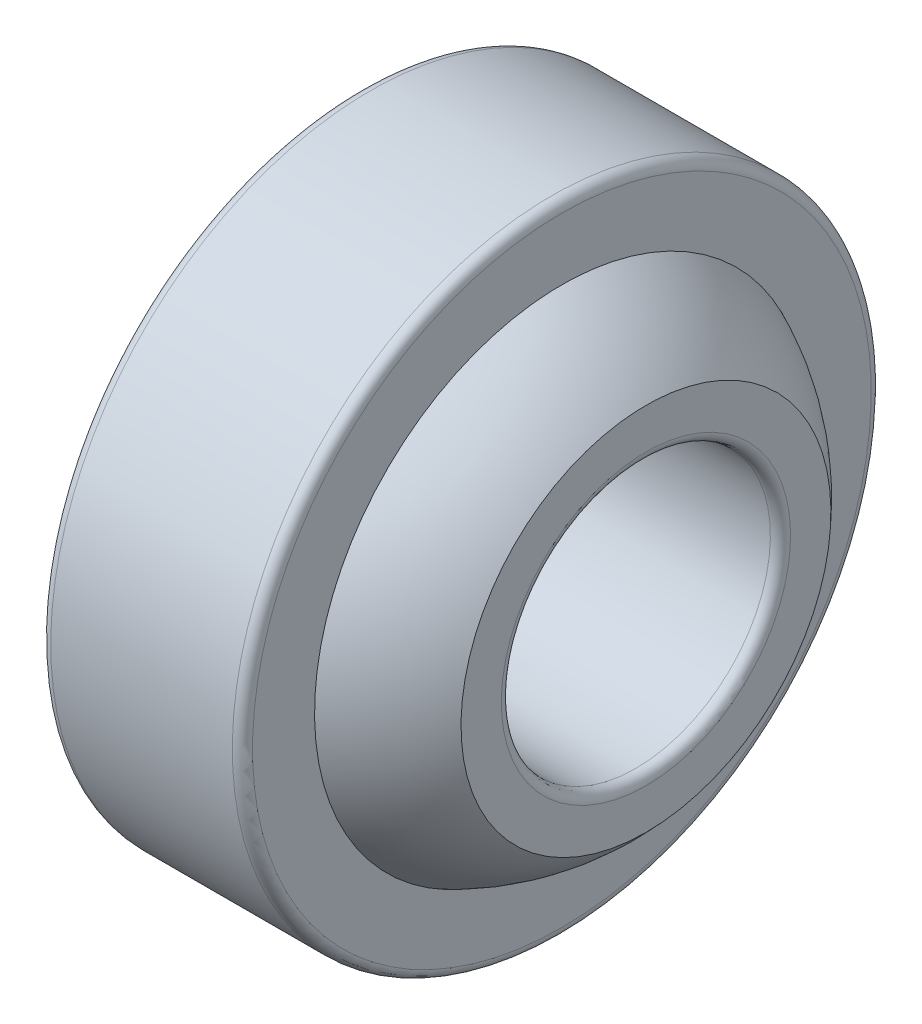
ISO-10303-21;
HEADER;
FILE_DESCRIPTION(('STEP AP214'),'2;1');
FILE_NAME('part.step','',(''),(''),'','','');
FILE_SCHEMA(('AUTOMOTIVE_DESIGN { 1 0 10303 214 1 1 1 1 }'));
ENDSEC;
DATA;
#1=APPLICATION_CONTEXT('core data for automotive mechanical design processes');
#2=APPLICATION_PROTOCOL_DEFINITION('international standard','automotive_design',2000,#1);
#3=PRODUCT_CONTEXT('',#1,'mechanical');
#4=PRODUCT('Part','Part','',(#3));
#5=PRODUCT_RELATED_PRODUCT_CATEGORY('part','',(#4));
#6=PRODUCT_DEFINITION_FORMATION('','',#4);
#7=PRODUCT_DEFINITION_CONTEXT('part definition',#1,'design');
#8=PRODUCT_DEFINITION('design','',#6,#7);
#9=PRODUCT_DEFINITION_SHAPE('','',#8);
#10=(LENGTH_UNIT() NAMED_UNIT(*) SI_UNIT(.MILLI.,.METRE.));
#11=(NAMED_UNIT(*) PLANE_ANGLE_UNIT() SI_UNIT($,.RADIAN.));
#12=(NAMED_UNIT(*) SI_UNIT($,.STERADIAN.) SOLID_ANGLE_UNIT());
#13=UNCERTAINTY_MEASURE_WITH_UNIT(LENGTH_MEASURE(1.E-05),#10,'distance_accuracy_value','');
#14=(GEOMETRIC_REPRESENTATION_CONTEXT(3) GLOBAL_UNCERTAINTY_ASSIGNED_CONTEXT((#13)) GLOBAL_UNIT_ASSIGNED_CONTEXT((#10,
#11,#12)) REPRESENTATION_CONTEXT('',''));
#15=CARTESIAN_POINT('',(0.,0.,0.));
#16=DIRECTION('',(0.,0.,1.));
#17=DIRECTION('',(1.,0.,0.));
#18=AXIS2_PLACEMENT_3D('',#15,#16,#17);
#19=CARTESIAN_POINT('',(0.,0.,0.));
#20=DIRECTION('',(-1.,0.,0.));
#21=DIRECTION('',(0.,-1.,0.));
#22=AXIS2_PLACEMENT_3D('',#19,#20,#21);
#23=DEGENERATE_TOROIDAL_SURFACE('',#22,0.699999999999997,7.3,.T.);
#24=CARTESIAN_POINT('',(-5.5,0.,0.));
#25=DIRECTION('',(-1.,0.,0.));
#26=DIRECTION('',(0.,-1.,0.));
#27=AXIS2_PLACEMENT_3D('',#24,#25,#26);
#28=CIRCLE('',#27,5.5);
#29=CARTESIAN_POINT('',(-5.5,-5.5,0.));
#30=VERTEX_POINT('',#29);
#31=EDGE_CURVE('E11',#30,#30,#28,.T.);
#32=ORIENTED_EDGE('',*,*,#31,.F.);
#33=EDGE_LOOP('',(#32));
#34=FACE_BOUND('',#33,.T.);
#35=CARTESIAN_POINT('',(5.5,0.,0.));
#36=DIRECTION('',(-1.,0.,0.));
#37=DIRECTION('',(0.,-1.,0.));
#38=AXIS2_PLACEMENT_3D('',#35,#36,#37);
#39=CIRCLE('',#38,5.5);
#40=CARTESIAN_POINT('',(5.5,-5.5,0.));
#41=VERTEX_POINT('',#40);
#42=EDGE_CURVE('E60',#41,#41,#39,.T.);
#43=ORIENTED_EDGE('',*,*,#42,.T.);
#44=EDGE_LOOP('',(#43));
#45=FACE_BOUND('',#44,.T.);
#46=ADVANCED_FACE('F38',(#34,#45),#23,.T.);
#47=CARTESIAN_POINT('',(-5.5,5.5,0.));
#48=DIRECTION('',(1.,0.,0.));
#49=DIRECTION('',(0.,1.,0.));
#50=AXIS2_PLACEMENT_3D('',#47,#48,#49);
#51=PLANE('',#50);
#52=CARTESIAN_POINT('',(-5.5,0.,0.));
#53=DIRECTION('',(-1.,0.,0.));
#54=DIRECTION('',(0.,-1.,0.));
#55=AXIS2_PLACEMENT_3D('',#52,#53,#54);
#56=CIRCLE('',#55,4.3);
#57=CARTESIAN_POINT('',(-5.5,-4.3,0.));
#58=VERTEX_POINT('',#57);
#59=EDGE_CURVE('E44',#58,#58,#56,.T.);
#60=ORIENTED_EDGE('',*,*,#59,.F.);
#61=EDGE_LOOP('',(#60));
#62=FACE_BOUND('',#61,.T.);
#63=ORIENTED_EDGE('',*,*,#31,.T.);
#64=EDGE_LOOP('',(#63));
#65=FACE_BOUND('',#64,.T.);
#66=ADVANCED_FACE('F85',(#62,#65),#51,.F.);
#67=CARTESIAN_POINT('',(-5.2,0.,0.));
#68=DIRECTION('',(-1.,0.,0.));
#69=DIRECTION('',(0.,-1.,0.));
#70=AXIS2_PLACEMENT_3D('',#67,#68,#69);
#71=TOROIDAL_SURFACE('',#70,4.3,0.3);
#72=CARTESIAN_POINT('',(-5.2,0.,0.));
#73=DIRECTION('',(-1.,0.,0.));
#74=DIRECTION('',(0.,-1.,0.));
#75=AXIS2_PLACEMENT_3D('',#72,#73,#74);
#76=CIRCLE('',#75,4.);
#77=CARTESIAN_POINT('',(-5.2,-4.,0.));
#78=VERTEX_POINT('',#77);
#79=EDGE_CURVE('E48',#78,#78,#76,.T.);
#80=ORIENTED_EDGE('',*,*,#79,.F.);
#81=EDGE_LOOP('',(#80));
#82=FACE_BOUND('',#81,.T.);
#83=ORIENTED_EDGE('',*,*,#59,.T.);
#84=EDGE_LOOP('',(#83));
#85=FACE_BOUND('',#84,.T.);
#86=ADVANCED_FACE('F80',(#82,#85),#71,.T.);
#87=CARTESIAN_POINT('',(-7.,0.,0.));
#88=DIRECTION('',(-1.,0.,0.));
#89=DIRECTION('',(0.,-1.,0.));
#90=AXIS2_PLACEMENT_3D('',#87,#88,#89);
#91=CYLINDRICAL_SURFACE('',#90,4.);
#92=CARTESIAN_POINT('',(5.2,0.,0.));
#93=DIRECTION('',(-1.,0.,0.));
#94=DIRECTION('',(0.,-1.,0.));
#95=AXIS2_PLACEMENT_3D('',#92,#93,#94);
#96=CIRCLE('',#95,4.);
#97=CARTESIAN_POINT('',(5.2,-4.,0.));
#98=VERTEX_POINT('',#97);
#99=EDGE_CURVE('E52',#98,#98,#96,.T.);
#100=ORIENTED_EDGE('',*,*,#99,.F.);
#101=EDGE_LOOP('',(#100));
#102=FACE_BOUND('',#101,.T.);
#103=ORIENTED_EDGE('',*,*,#79,.T.);
#104=EDGE_LOOP('',(#103));
#105=FACE_BOUND('',#104,.T.);
#106=ADVANCED_FACE('F74',(#102,#105),#91,.F.);
#107=CARTESIAN_POINT('',(5.2,0.,0.));
#108=DIRECTION('',(-1.,0.,0.));
#109=DIRECTION('',(0.,-1.,0.));
#110=AXIS2_PLACEMENT_3D('',#107,#108,#109);
#111=TOROIDAL_SURFACE('',#110,4.3,0.299999999999999);
#112=CARTESIAN_POINT('',(5.5,0.,0.));
#113=DIRECTION('',(-1.,0.,0.));
#114=DIRECTION('',(0.,-1.,0.));
#115=AXIS2_PLACEMENT_3D('',#112,#113,#114);
#116=CIRCLE('',#115,4.3);
#117=CARTESIAN_POINT('',(5.5,-4.3,0.));
#118=VERTEX_POINT('',#117);
#119=EDGE_CURVE('E57',#118,#118,#116,.T.);
#120=ORIENTED_EDGE('',*,*,#119,.F.);
#121=EDGE_LOOP('',(#120));
#122=FACE_BOUND('',#121,.T.);
#123=ORIENTED_EDGE('',*,*,#99,.T.);
#124=EDGE_LOOP('',(#123));
#125=FACE_BOUND('',#124,.T.);
#126=ADVANCED_FACE('F68',(#122,#125),#111,.T.);
#127=CARTESIAN_POINT('',(5.5,5.5,0.));
#128=DIRECTION('',(-1.,0.,0.));
#129=DIRECTION('',(0.,-1.,0.));
#130=AXIS2_PLACEMENT_3D('',#127,#128,#129);
#131=PLANE('',#130);
#132=ORIENTED_EDGE('',*,*,#42,.F.);
#133=EDGE_LOOP('',(#132));
#134=FACE_BOUND('',#133,.T.);
#135=ORIENTED_EDGE('',*,*,#119,.T.);
#136=EDGE_LOOP('',(#135));
#137=FACE_BOUND('',#136,.T.);
#138=ADVANCED_FACE('F65',(#134,#137),#131,.F.);
#139=CLOSED_SHELL('',(#46,#66,#86,#106,#126,#138));
#140=MANIFOLD_SOLID_BREP('B2',#139);
#141=CARTESIAN_POINT('',(0.,0.,0.));
#142=DIRECTION('',(-1.,0.,0.));
#143=DIRECTION('',(0.,-1.,0.));
#144=AXIS2_PLACEMENT_3D('',#141,#142,#143);
#145=DEGENERATE_TOROIDAL_SURFACE('',#144,0.699999999999997,7.3,.T.);
#146=CARTESIAN_POINT('',(3.,0.,0.));
#147=DIRECTION('',(-1.,0.,0.));
#148=DIRECTION('',(0.,-1.,0.));
#149=AXIS2_PLACEMENT_3D('',#146,#147,#148);
#150=CIRCLE('',#149,7.35507325278993);
#151=CARTESIAN_POINT('',(3.,-7.35507325278993,0.));
#152=VERTEX_POINT('',#151);
#153=EDGE_CURVE('E37',#152,#152,#150,.T.);
#154=ORIENTED_EDGE('',*,*,#153,.F.);
#155=EDGE_LOOP('',(#154));
#156=FACE_BOUND('',#155,.T.);
#157=CARTESIAN_POINT('',(-3.,0.,0.));
#158=DIRECTION('',(-1.,0.,0.));
#159=DIRECTION('',(0.,-1.,0.));
#160=AXIS2_PLACEMENT_3D('',#157,#158,#159);
#161=CIRCLE('',#160,7.35507325278993);
#162=CARTESIAN_POINT('',(-3.,-7.35507325278993,0.));
#163=VERTEX_POINT('',#162);
#164=EDGE_CURVE('E151',#163,#163,#161,.T.);
#165=ORIENTED_EDGE('',*,*,#164,.T.);
#166=EDGE_LOOP('',(#165));
#167=FACE_BOUND('',#166,.T.);
#168=ADVANCED_FACE('F129',(#156,#167),#145,.F.);
#169=CARTESIAN_POINT('',(3.,9.2,0.));
#170=DIRECTION('',(-1.,0.,0.));
#171=DIRECTION('',(0.,-1.,0.));
#172=AXIS2_PLACEMENT_3D('',#169,#170,#171);
#173=PLANE('',#172);
#174=CARTESIAN_POINT('',(3.,0.,0.));
#175=DIRECTION('',(-1.,0.,0.));
#176=DIRECTION('',(0.,-1.,0.));
#177=AXIS2_PLACEMENT_3D('',#174,#175,#176);
#178=CIRCLE('',#177,9.2);
#179=CARTESIAN_POINT('',(3.,-9.2,0.));
#180=VERTEX_POINT('',#179);
#181=EDGE_CURVE('E135',#180,#180,#178,.T.);
#182=ORIENTED_EDGE('',*,*,#181,.F.);
#183=EDGE_LOOP('',(#182));
#184=FACE_BOUND('',#183,.T.);
#185=ORIENTED_EDGE('',*,*,#153,.T.);
#186=EDGE_LOOP('',(#185));
#187=FACE_BOUND('',#186,.T.);
#188=ADVANCED_FACE('F176',(#184,#187),#173,.F.);
#189=CARTESIAN_POINT('',(2.7,0.,0.));
#190=DIRECTION('',(-1.,0.,0.));
#191=DIRECTION('',(0.,-1.,0.));
#192=AXIS2_PLACEMENT_3D('',#189,#190,#191);
#193=TOROIDAL_SURFACE('',#192,9.2,0.3);
#194=CARTESIAN_POINT('',(2.7,0.,0.));
#195=DIRECTION('',(-1.,0.,0.));
#196=DIRECTION('',(0.,-1.,0.));
#197=AXIS2_PLACEMENT_3D('',#194,#195,#196);
#198=CIRCLE('',#197,9.5);
#199=CARTESIAN_POINT('',(2.70000000000001,-9.5,0.));
#200=VERTEX_POINT('',#199);
#201=EDGE_CURVE('E139',#200,#200,#198,.T.);
#202=ORIENTED_EDGE('',*,*,#201,.F.);
#203=EDGE_LOOP('',(#202));
#204=FACE_BOUND('',#203,.T.);
#205=ORIENTED_EDGE('',*,*,#181,.T.);
#206=EDGE_LOOP('',(#205));
#207=FACE_BOUND('',#206,.T.);
#208=ADVANCED_FACE('F171',(#204,#207),#193,.T.);
#209=CARTESIAN_POINT('',(-7.,0.,0.));
#210=DIRECTION('',(-1.,0.,0.));
#211=DIRECTION('',(0.,-1.,0.));
#212=AXIS2_PLACEMENT_3D('',#209,#210,#211);
#213=CYLINDRICAL_SURFACE('',#212,9.5);
#214=CARTESIAN_POINT('',(-2.7,0.,0.));
#215=DIRECTION('',(-1.,0.,0.));
#216=DIRECTION('',(0.,-1.,0.));
#217=AXIS2_PLACEMENT_3D('',#214,#215,#216);
#218=CIRCLE('',#217,9.5);
#219=CARTESIAN_POINT('',(-2.7,-9.5,0.));
#220=VERTEX_POINT('',#219);
#221=EDGE_CURVE('E143',#220,#220,#218,.T.);
#222=ORIENTED_EDGE('',*,*,#221,.F.);
#223=EDGE_LOOP('',(#222));
#224=FACE_BOUND('',#223,.T.);
#225=ORIENTED_EDGE('',*,*,#201,.T.);
#226=EDGE_LOOP('',(#225));
#227=FACE_BOUND('',#226,.T.);
#228=ADVANCED_FACE('F165',(#224,#227),#213,.T.);
#229=CARTESIAN_POINT('',(-2.7,0.,0.));
#230=DIRECTION('',(-1.,0.,0.));
#231=DIRECTION('',(0.,-1.,0.));
#232=AXIS2_PLACEMENT_3D('',#229,#230,#231);
#233=TOROIDAL_SURFACE('',#232,9.2,0.3);
#234=CARTESIAN_POINT('',(-3.,0.,0.));
#235=DIRECTION('',(-1.,0.,0.));
#236=DIRECTION('',(0.,-1.,0.));
#237=AXIS2_PLACEMENT_3D('',#234,#235,#236);
#238=CIRCLE('',#237,9.2);
#239=CARTESIAN_POINT('',(-3.,-9.2,0.));
#240=VERTEX_POINT('',#239);
#241=EDGE_CURVE('E148',#240,#240,#238,.T.);
#242=ORIENTED_EDGE('',*,*,#241,.F.);
#243=EDGE_LOOP('',(#242));
#244=FACE_BOUND('',#243,.T.);
#245=ORIENTED_EDGE('',*,*,#221,.T.);
#246=EDGE_LOOP('',(#245));
#247=FACE_BOUND('',#246,.T.);
#248=ADVANCED_FACE('F159',(#244,#247),#233,.T.);
#249=CARTESIAN_POINT('',(-3.,7.35507325278993,0.));
#250=DIRECTION('',(1.,0.,0.));
#251=DIRECTION('',(0.,1.,0.));
#252=AXIS2_PLACEMENT_3D('',#249,#250,#251);
#253=PLANE('',#252);
#254=ORIENTED_EDGE('',*,*,#164,.F.);
#255=EDGE_LOOP('',(#254));
#256=FACE_BOUND('',#255,.T.);
#257=ORIENTED_EDGE('',*,*,#241,.T.);
#258=EDGE_LOOP('',(#257));
#259=FACE_BOUND('',#258,.T.);
#260=ADVANCED_FACE('F156',(#256,#259),#253,.F.);
#261=CLOSED_SHELL('',(#168,#188,#208,#228,#248,#260));
#262=MANIFOLD_SOLID_BREP('B6',#261);
#263=ADVANCED_BREP_SHAPE_REPRESENTATION('',(#18,#140,#262),#14);
#264=SHAPE_DEFINITION_REPRESENTATION(#9,#263);
ENDSEC;
END-ISO-10303-21;
